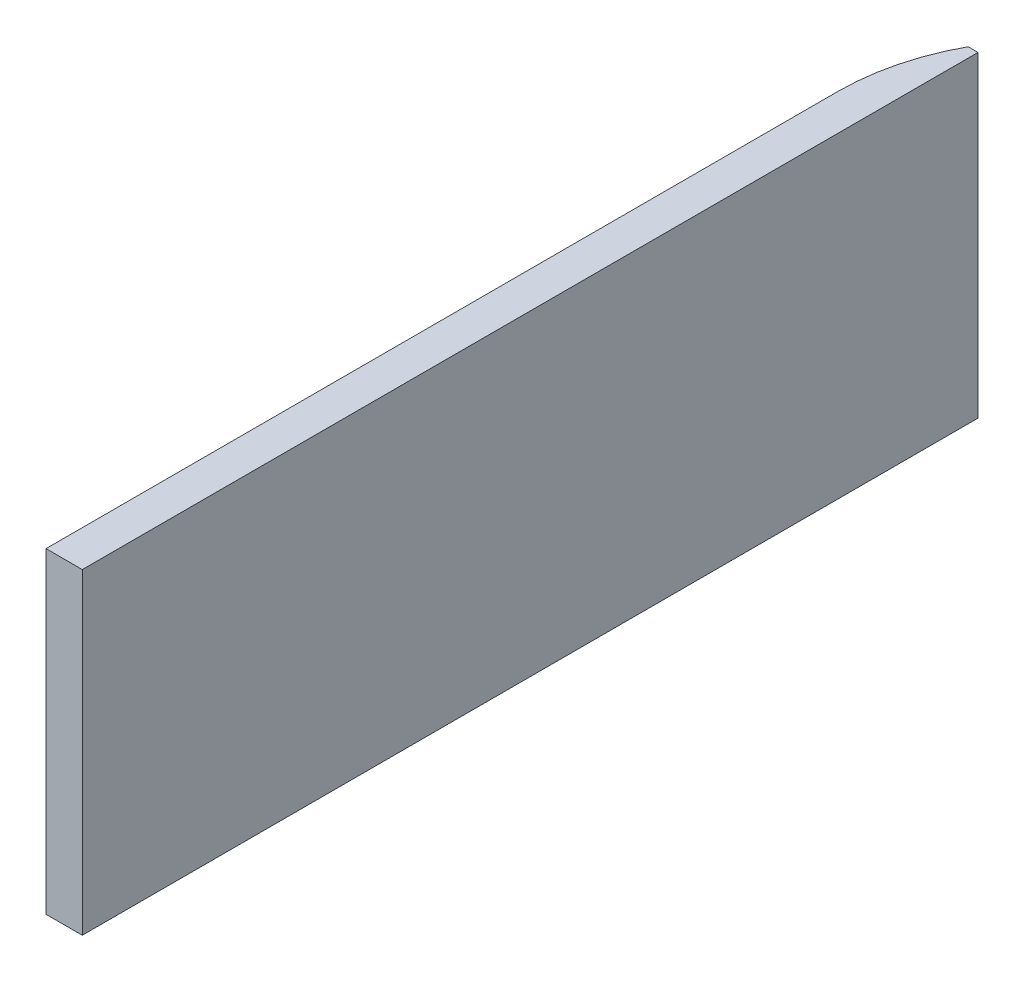
ISO-10303-21;
HEADER;
FILE_DESCRIPTION(('STEP AP214'),'2;1');
FILE_NAME('part.step','',(''),(''),'','','');
FILE_SCHEMA(('AUTOMOTIVE_DESIGN { 1 0 10303 214 1 1 1 1 }'));
ENDSEC;
DATA;
#1=APPLICATION_CONTEXT('core data for automotive mechanical design processes');
#2=APPLICATION_PROTOCOL_DEFINITION('international standard','automotive_design',2000,#1);
#3=PRODUCT_CONTEXT('',#1,'mechanical');
#4=PRODUCT('Part','Part','',(#3));
#5=PRODUCT_RELATED_PRODUCT_CATEGORY('part','',(#4));
#6=PRODUCT_DEFINITION_FORMATION('','',#4);
#7=PRODUCT_DEFINITION_CONTEXT('part definition',#1,'design');
#8=PRODUCT_DEFINITION('design','',#6,#7);
#9=PRODUCT_DEFINITION_SHAPE('','',#8);
#10=(LENGTH_UNIT() NAMED_UNIT(*) SI_UNIT(.MILLI.,.METRE.));
#11=(NAMED_UNIT(*) PLANE_ANGLE_UNIT() SI_UNIT($,.RADIAN.));
#12=(NAMED_UNIT(*) SI_UNIT($,.STERADIAN.) SOLID_ANGLE_UNIT());
#13=UNCERTAINTY_MEASURE_WITH_UNIT(LENGTH_MEASURE(1.E-05),#10,'distance_accuracy_value','');
#14=(GEOMETRIC_REPRESENTATION_CONTEXT(3) GLOBAL_UNCERTAINTY_ASSIGNED_CONTEXT((#13)) GLOBAL_UNIT_ASSIGNED_CONTEXT((#10,
#11,#12)) REPRESENTATION_CONTEXT('',''));
#15=CARTESIAN_POINT('',(0.,0.,0.));
#16=DIRECTION('',(0.,0.,1.));
#17=DIRECTION('',(1.,0.,0.));
#18=AXIS2_PLACEMENT_3D('',#15,#16,#17);
#19=CARTESIAN_POINT('',(31.5172932850577,19.05,1637.09701144482));
#20=DIRECTION('',(0.,-1.,0.));
#21=DIRECTION('',(0.,0.,-1.));
#22=AXIS2_PLACEMENT_3D('',#19,#20,#21);
#23=PLANE('',#22);
#24=DIRECTION('',(-1.,0.,0.));
#25=VECTOR('',#24,1.);
#26=CARTESIAN_POINT('',(913.884595899993,19.05,1637.09701144482));
#27=LINE('',#26,#25);
#28=CARTESIAN_POINT('',(691.552867991864,19.05,1637.09701144482));
#29=VERTEX_POINT('',#28);
#30=CARTESIAN_POINT('',(668.266595899993,19.05,1637.09701144482));
#31=VERTEX_POINT('',#30);
#32=EDGE_CURVE('E96',#29,#31,#27,.T.);
#33=ORIENTED_EDGE('',*,*,#32,.T.);
#34=DIRECTION('',(0.,0.,1.));
#35=VECTOR('',#34,1.);
#36=CARTESIAN_POINT('',(668.266595899993,19.05,1637.09701144482));
#37=LINE('',#36,#35);
#38=CARTESIAN_POINT('',(668.266595899993,19.0499999999989,1129.09701144482));
#39=VERTEX_POINT('',#38);
#40=EDGE_CURVE('E54',#39,#31,#37,.T.);
#41=ORIENTED_EDGE('',*,*,#40,.F.);
#42=CARTESIAN_POINT('',(807.966595899993,19.0499999999989,1129.09701144482));
#43=DIRECTION('',(0.,-1.,0.));
#44=DIRECTION('',(0.,0.,-1.));
#45=AXIS2_PLACEMENT_3D('',#42,#43,#44);
#46=CIRCLE('',#45,139.7);
#47=CARTESIAN_POINT('',(685.202867991864,19.05,1062.425));
#48=VERTEX_POINT('',#47);
#49=EDGE_CURVE('E61',#48,#39,#46,.F.);
#50=ORIENTED_EDGE('',*,*,#49,.F.);
#51=DIRECTION('',(1.,0.,0.));
#52=VECTOR('',#51,1.);
#53=CARTESIAN_POINT('',(31.5172932850577,19.05,1062.425));
#54=LINE('',#53,#52);
#55=CARTESIAN_POINT('',(691.552867991864,19.05,1062.425));
#56=VERTEX_POINT('',#55);
#57=EDGE_CURVE('E127',#48,#56,#54,.T.);
#58=ORIENTED_EDGE('',*,*,#57,.T.);
#59=DIRECTION('',(0.,0.,-1.));
#60=VECTOR('',#59,1.);
#61=CARTESIAN_POINT('',(691.552867991864,19.05,1637.09701144482));
#62=LINE('',#61,#60);
#63=EDGE_CURVE('E105',#29,#56,#62,.T.);
#64=ORIENTED_EDGE('',*,*,#63,.F.);
#65=EDGE_LOOP('',(#33,#41,#50,#58,#64));
#66=FACE_BOUND('',#65,.T.);
#67=ADVANCED_FACE('F45',(#66),#23,.T.);
#68=CARTESIAN_POINT('',(31.5172932850577,222.25,1637.09701144482));
#69=DIRECTION('',(0.,1.,0.));
#70=DIRECTION('',(0.,0.,1.));
#71=AXIS2_PLACEMENT_3D('',#68,#69,#70);
#72=PLANE('',#71);
#73=CARTESIAN_POINT('',(807.966595899993,222.25,1129.09701144482));
#74=DIRECTION('',(0.,-1.,0.));
#75=DIRECTION('',(0.,0.,1.));
#76=AXIS2_PLACEMENT_3D('',#73,#74,#75);
#77=CIRCLE('',#76,139.7);
#78=CARTESIAN_POINT('',(668.266595899993,222.25,1129.09701144482));
#79=VERTEX_POINT('',#78);
#80=CARTESIAN_POINT('',(685.202867991864,222.25,1062.425));
#81=VERTEX_POINT('',#80);
#82=EDGE_CURVE('E107',#79,#81,#77,.T.);
#83=ORIENTED_EDGE('',*,*,#82,.F.);
#84=DIRECTION('',(0.,0.,-1.));
#85=VECTOR('',#84,1.);
#86=CARTESIAN_POINT('',(668.266595899993,222.25,1637.09701144482));
#87=LINE('',#86,#85);
#88=CARTESIAN_POINT('',(668.266595899993,222.25,1637.09701144482));
#89=VERTEX_POINT('',#88);
#90=EDGE_CURVE('E100',#89,#79,#87,.T.);
#91=ORIENTED_EDGE('',*,*,#90,.F.);
#92=DIRECTION('',(1.,0.,0.));
#93=VECTOR('',#92,1.);
#94=CARTESIAN_POINT('',(31.5172932850577,222.25,1637.09701144482));
#95=LINE('',#94,#93);
#96=CARTESIAN_POINT('',(691.552867991864,222.25,1637.09701144482));
#97=VERTEX_POINT('',#96);
#98=EDGE_CURVE('E98',#89,#97,#95,.T.);
#99=ORIENTED_EDGE('',*,*,#98,.T.);
#100=DIRECTION('',(0.,0.,1.));
#101=VECTOR('',#100,1.);
#102=CARTESIAN_POINT('',(691.552867991864,222.25,1637.09701144482));
#103=LINE('',#102,#101);
#104=CARTESIAN_POINT('',(691.552867991864,222.25,1062.425));
#105=VERTEX_POINT('',#104);
#106=EDGE_CURVE('E118',#105,#97,#103,.T.);
#107=ORIENTED_EDGE('',*,*,#106,.F.);
#108=DIRECTION('',(1.,0.,0.));
#109=VECTOR('',#108,1.);
#110=CARTESIAN_POINT('',(31.5172932850577,222.25,1062.425));
#111=LINE('',#110,#109);
#112=EDGE_CURVE('E130',#81,#105,#111,.T.);
#113=ORIENTED_EDGE('',*,*,#112,.F.);
#114=EDGE_LOOP('',(#83,#91,#99,#107,#113));
#115=FACE_BOUND('',#114,.T.);
#116=ADVANCED_FACE('F143',(#115),#72,.T.);
#117=CARTESIAN_POINT('',(31.5172932850577,222.25,1637.09701144482));
#118=DIRECTION('',(0.,0.,1.));
#119=DIRECTION('',(1.,0.,0.));
#120=AXIS2_PLACEMENT_3D('',#117,#118,#119);
#121=PLANE('',#120);
#122=DIRECTION('',(0.,1.,0.));
#123=VECTOR('',#122,1.);
#124=CARTESIAN_POINT('',(668.266595899993,222.25,1637.09701144482));
#125=LINE('',#124,#123);
#126=EDGE_CURVE('E68',#31,#89,#125,.T.);
#127=ORIENTED_EDGE('',*,*,#126,.F.);
#128=ORIENTED_EDGE('',*,*,#32,.F.);
#129=DIRECTION('',(0.,-1.,0.));
#130=VECTOR('',#129,1.);
#131=CARTESIAN_POINT('',(691.552867991864,222.25,1637.09701144482));
#132=LINE('',#131,#130);
#133=EDGE_CURVE('E122',#97,#29,#132,.T.);
#134=ORIENTED_EDGE('',*,*,#133,.F.);
#135=ORIENTED_EDGE('',*,*,#98,.F.);
#136=EDGE_LOOP('',(#127,#128,#134,#135));
#137=FACE_BOUND('',#136,.T.);
#138=ADVANCED_FACE('F94',(#137),#121,.T.);
#139=CARTESIAN_POINT('',(31.5172932850577,222.25,1062.425));
#140=DIRECTION('',(0.,0.,-1.));
#141=DIRECTION('',(-1.,0.,0.));
#142=AXIS2_PLACEMENT_3D('',#139,#140,#141);
#143=PLANE('',#142);
#144=DIRECTION('',(0.,1.,0.));
#145=VECTOR('',#144,1.);
#146=CARTESIAN_POINT('',(685.202867991864,-23.3680000000001,1062.425));
#147=LINE('',#146,#145);
#148=EDGE_CURVE('E148',#48,#81,#147,.T.);
#149=ORIENTED_EDGE('',*,*,#148,.T.);
#150=ORIENTED_EDGE('',*,*,#112,.T.);
#151=DIRECTION('',(0.,1.,0.));
#152=VECTOR('',#151,1.);
#153=CARTESIAN_POINT('',(691.552867991864,222.25,1062.425));
#154=LINE('',#153,#152);
#155=EDGE_CURVE('E114',#56,#105,#154,.T.);
#156=ORIENTED_EDGE('',*,*,#155,.F.);
#157=ORIENTED_EDGE('',*,*,#57,.F.);
#158=EDGE_LOOP('',(#149,#150,#156,#157));
#159=FACE_BOUND('',#158,.T.);
#160=ADVANCED_FACE('F47',(#159),#143,.T.);
#161=CARTESIAN_POINT('',(691.552867991864,60.2299826650741,1672.73876172581));
#162=DIRECTION('',(1.,0.,0.));
#163=DIRECTION('',(0.,0.,-1.));
#164=AXIS2_PLACEMENT_3D('',#161,#162,#163);
#165=PLANE('',#164);
#166=ORIENTED_EDGE('',*,*,#133,.T.);
#167=ORIENTED_EDGE('',*,*,#63,.T.);
#168=ORIENTED_EDGE('',*,*,#155,.T.);
#169=ORIENTED_EDGE('',*,*,#106,.T.);
#170=EDGE_LOOP('',(#166,#167,#168,#169));
#171=FACE_BOUND('',#170,.T.);
#172=ADVANCED_FACE('F140',(#171),#165,.T.);
#173=CARTESIAN_POINT('',(668.266595899993,222.25,1637.09701144482));
#174=DIRECTION('',(1.,0.,0.));
#175=DIRECTION('',(0.,0.,1.));
#176=AXIS2_PLACEMENT_3D('',#173,#174,#175);
#177=PLANE('',#176);
#178=ORIENTED_EDGE('',*,*,#40,.T.);
#179=ORIENTED_EDGE('',*,*,#126,.T.);
#180=ORIENTED_EDGE('',*,*,#90,.T.);
#181=DIRECTION('',(0.,-1.,0.));
#182=VECTOR('',#181,1.);
#183=CARTESIAN_POINT('',(668.266595899993,222.25,1129.09701144482));
#184=LINE('',#183,#182);
#185=EDGE_CURVE('E11',#79,#39,#184,.T.);
#186=ORIENTED_EDGE('',*,*,#185,.T.);
#187=EDGE_LOOP('',(#178,#179,#180,#186));
#188=FACE_BOUND('',#187,.T.);
#189=ADVANCED_FACE('F109',(#188),#177,.F.);
#190=CARTESIAN_POINT('',(807.966595899993,-23.3680000000001,1129.09701144482));
#191=DIRECTION('',(0.,1.,0.));
#192=DIRECTION('',(0.,0.,1.));
#193=AXIS2_PLACEMENT_3D('',#190,#191,#192);
#194=CYLINDRICAL_SURFACE('',#193,139.7);
#195=ORIENTED_EDGE('',*,*,#49,.T.);
#196=ORIENTED_EDGE('',*,*,#185,.F.);
#197=ORIENTED_EDGE('',*,*,#82,.T.);
#198=ORIENTED_EDGE('',*,*,#148,.F.);
#199=EDGE_LOOP('',(#195,#196,#197,#198));
#200=FACE_BOUND('',#199,.T.);
#201=ADVANCED_FACE('F152',(#200),#194,.T.);
#202=CLOSED_SHELL('',(#67,#116,#138,#160,#172,#189,#201));
#203=MANIFOLD_SOLID_BREP('B2',#202);
#204=ADVANCED_BREP_SHAPE_REPRESENTATION('',(#18,#203),#14);
#205=SHAPE_DEFINITION_REPRESENTATION(#9,#204);
ENDSEC;
END-ISO-10303-21;
